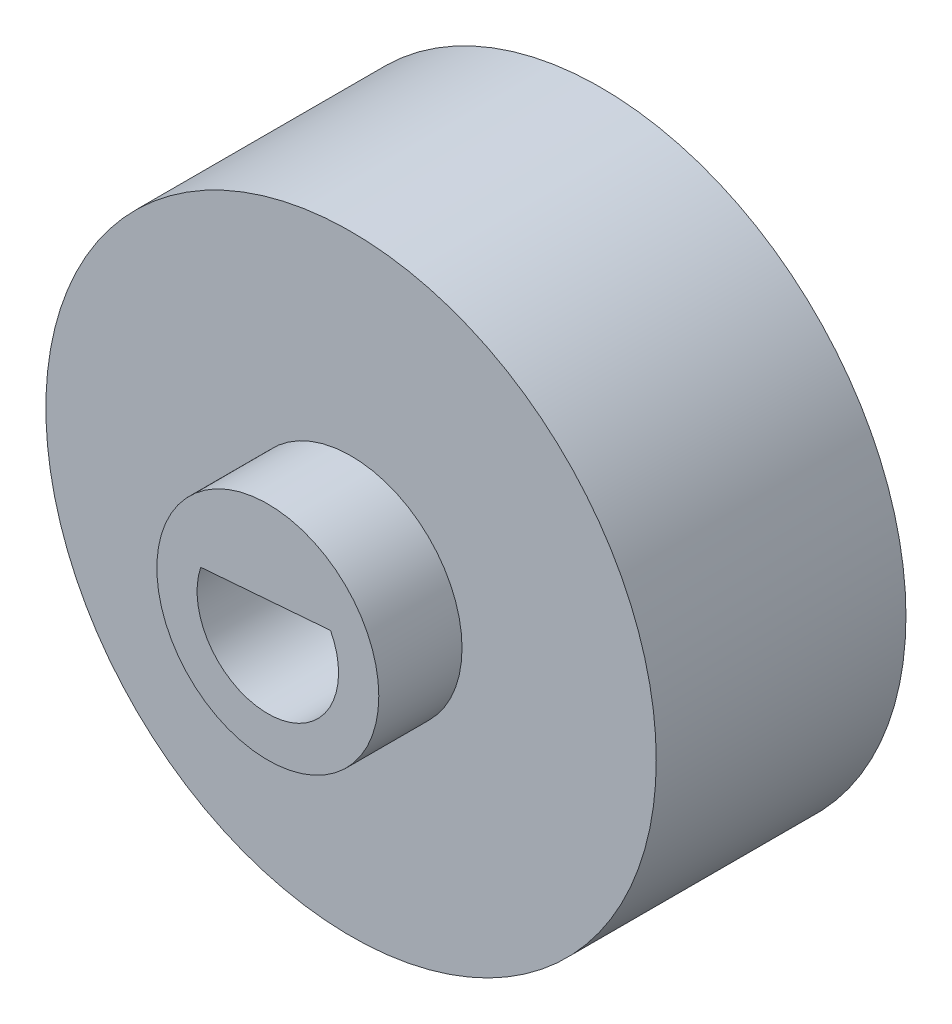
ISO-10303-21;
HEADER;
FILE_DESCRIPTION(('STEP AP214'),'2;1');
FILE_NAME('part.step','',(''),(''),'','','');
FILE_SCHEMA(('AUTOMOTIVE_DESIGN { 1 0 10303 214 1 1 1 1 }'));
ENDSEC;
DATA;
#1=APPLICATION_CONTEXT('core data for automotive mechanical design processes');
#2=APPLICATION_PROTOCOL_DEFINITION('international standard','automotive_design',2000,#1);
#3=PRODUCT_CONTEXT('',#1,'mechanical');
#4=PRODUCT('Part','Part','',(#3));
#5=PRODUCT_RELATED_PRODUCT_CATEGORY('part','',(#4));
#6=PRODUCT_DEFINITION_FORMATION('','',#4);
#7=PRODUCT_DEFINITION_CONTEXT('part definition',#1,'design');
#8=PRODUCT_DEFINITION('design','',#6,#7);
#9=PRODUCT_DEFINITION_SHAPE('','',#8);
#10=(LENGTH_UNIT() NAMED_UNIT(*) SI_UNIT(.MILLI.,.METRE.));
#11=(NAMED_UNIT(*) PLANE_ANGLE_UNIT() SI_UNIT($,.RADIAN.));
#12=(NAMED_UNIT(*) SI_UNIT($,.STERADIAN.) SOLID_ANGLE_UNIT());
#13=UNCERTAINTY_MEASURE_WITH_UNIT(LENGTH_MEASURE(1.E-05),#10,'distance_accuracy_value','');
#14=(GEOMETRIC_REPRESENTATION_CONTEXT(3) GLOBAL_UNCERTAINTY_ASSIGNED_CONTEXT((#13)) GLOBAL_UNIT_ASSIGNED_CONTEXT((#10,
#11,#12)) REPRESENTATION_CONTEXT('',''));
#15=CARTESIAN_POINT('',(0.,0.,0.));
#16=DIRECTION('',(0.,0.,1.));
#17=DIRECTION('',(1.,0.,0.));
#18=AXIS2_PLACEMENT_3D('',#15,#16,#17);
#19=CARTESIAN_POINT('',(0.,0.,24.));
#20=DIRECTION('',(0.,0.,1.));
#21=DIRECTION('',(1.,0.,0.));
#22=AXIS2_PLACEMENT_3D('',#19,#20,#21);
#23=PLANE('',#22);
#24=CARTESIAN_POINT('',(0.,0.,24.));
#25=DIRECTION('',(0.,0.,1.));
#26=DIRECTION('',(1.,0.,0.));
#27=AXIS2_PLACEMENT_3D('',#24,#25,#26);
#28=CIRCLE('',#27,8.);
#29=CARTESIAN_POINT('',(8.,0.,24.));
#30=VERTEX_POINT('',#29);
#31=EDGE_CURVE('E11',#30,#30,#28,.T.);
#32=ORIENTED_EDGE('',*,*,#31,.T.);
#33=EDGE_LOOP('',(#32));
#34=FACE_BOUND('',#33,.T.);
#35=DIRECTION('',(-0.996917333733128,-0.0784590957278449,0.));
#36=VECTOR('',#35,1.);
#37=CARTESIAN_POINT('',(4.52010117863992,2.36192407474458,24.));
#38=LINE('',#37,#36);
#39=CARTESIAN_POINT('',(4.52010117863992,2.36192407474458,24.));
#40=VERTEX_POINT('',#39);
#41=CARTESIAN_POINT('',(-4.83393756155129,1.62574526018793,24.));
#42=VERTEX_POINT('',#41);
#43=EDGE_CURVE('E83',#40,#42,#38,.T.);
#44=ORIENTED_EDGE('',*,*,#43,.F.);
#45=CARTESIAN_POINT('',(0.,0.,24.));
#46=DIRECTION('',(0.,0.,1.));
#47=DIRECTION('',(1.,0.,0.));
#48=AXIS2_PLACEMENT_3D('',#45,#46,#47);
#49=CIRCLE('',#48,5.1);
#50=EDGE_CURVE('E70',#42,#40,#49,.T.);
#51=ORIENTED_EDGE('',*,*,#50,.F.);
#52=EDGE_LOOP('',(#44,#51));
#53=FACE_BOUND('',#52,.T.);
#54=ADVANCED_FACE('F39',(#34,#53),#23,.T.);
#55=CARTESIAN_POINT('',(0.,0.,0.));
#56=DIRECTION('',(0.,0.,1.));
#57=DIRECTION('',(1.,0.,0.));
#58=AXIS2_PLACEMENT_3D('',#55,#56,#57);
#59=PLANE('',#58);
#60=CARTESIAN_POINT('',(0.,0.,0.));
#61=DIRECTION('',(0.,0.,1.));
#62=DIRECTION('',(1.,0.,0.));
#63=AXIS2_PLACEMENT_3D('',#60,#61,#62);
#64=CIRCLE('',#63,5.1);
#65=CARTESIAN_POINT('',(-4.83393756155129,1.62574526018793,0.));
#66=VERTEX_POINT('',#65);
#67=CARTESIAN_POINT('',(4.52010117863992,2.36192407474458,0.));
#68=VERTEX_POINT('',#67);
#69=EDGE_CURVE('E60',#66,#68,#64,.T.);
#70=ORIENTED_EDGE('',*,*,#69,.T.);
#71=DIRECTION('',(-0.996917333733128,-0.0784590957278449,0.));
#72=VECTOR('',#71,1.);
#73=CARTESIAN_POINT('',(4.52010117863992,2.36192407474458,0.));
#74=LINE('',#73,#72);
#75=EDGE_CURVE('E66',#68,#66,#74,.T.);
#76=ORIENTED_EDGE('',*,*,#75,.T.);
#77=EDGE_LOOP('',(#70,#76));
#78=FACE_BOUND('',#77,.T.);
#79=CARTESIAN_POINT('',(0.,0.,0.));
#80=DIRECTION('',(0.,0.,1.));
#81=DIRECTION('',(1.,0.,0.));
#82=AXIS2_PLACEMENT_3D('',#79,#80,#81);
#83=CIRCLE('',#82,22.);
#84=CARTESIAN_POINT('',(22.,0.,0.));
#85=VERTEX_POINT('',#84);
#86=EDGE_CURVE('E80',#85,#85,#83,.T.);
#87=ORIENTED_EDGE('',*,*,#86,.F.);
#88=EDGE_LOOP('',(#87));
#89=FACE_BOUND('',#88,.T.);
#90=ADVANCED_FACE('F75',(#78,#89),#59,.F.);
#91=CARTESIAN_POINT('',(0.,0.,24.));
#92=DIRECTION('',(0.,0.,-1.));
#93=DIRECTION('',(-1.,0.,0.));
#94=AXIS2_PLACEMENT_3D('',#91,#92,#93);
#95=CYLINDRICAL_SURFACE('',#94,8.);
#96=CARTESIAN_POINT('',(0.,0.,18.));
#97=DIRECTION('',(0.,0.,1.));
#98=DIRECTION('',(1.,0.,0.));
#99=AXIS2_PLACEMENT_3D('',#96,#97,#98);
#100=CIRCLE('',#99,8.);
#101=CARTESIAN_POINT('',(8.,0.,18.));
#102=VERTEX_POINT('',#101);
#103=EDGE_CURVE('E88',#102,#102,#100,.T.);
#104=ORIENTED_EDGE('',*,*,#103,.T.);
#105=EDGE_LOOP('',(#104));
#106=FACE_BOUND('',#105,.T.);
#107=ORIENTED_EDGE('',*,*,#31,.F.);
#108=EDGE_LOOP('',(#107));
#109=FACE_BOUND('',#108,.T.);
#110=ADVANCED_FACE('F41',(#106,#109),#95,.T.);
#111=CARTESIAN_POINT('',(0.,0.,24.));
#112=DIRECTION('',(0.,0.,-1.));
#113=DIRECTION('',(-1.,0.,0.));
#114=AXIS2_PLACEMENT_3D('',#111,#112,#113);
#115=CYLINDRICAL_SURFACE('',#114,5.1);
#116=ORIENTED_EDGE('',*,*,#69,.F.);
#117=DIRECTION('',(0.,0.,-1.));
#118=VECTOR('',#117,1.);
#119=CARTESIAN_POINT('',(-4.83393756155129,1.62574526018793,24.));
#120=LINE('',#119,#118);
#121=EDGE_CURVE('E68',#42,#66,#120,.T.);
#122=ORIENTED_EDGE('',*,*,#121,.F.);
#123=ORIENTED_EDGE('',*,*,#50,.T.);
#124=DIRECTION('',(0.,0.,-1.));
#125=VECTOR('',#124,1.);
#126=CARTESIAN_POINT('',(4.52010117863992,2.36192407474458,24.));
#127=LINE('',#126,#125);
#128=EDGE_CURVE('E47',#40,#68,#127,.T.);
#129=ORIENTED_EDGE('',*,*,#128,.T.);
#130=EDGE_LOOP('',(#116,#122,#123,#129));
#131=FACE_BOUND('',#130,.T.);
#132=ADVANCED_FACE('F72',(#131),#115,.F.);
#133=CARTESIAN_POINT('',(4.52010117863992,2.36192407474458,24.));
#134=DIRECTION('',(0.0784590957278449,-0.996917333733128,0.));
#135=DIRECTION('',(0.996917333733128,0.0784590957278449,0.));
#136=AXIS2_PLACEMENT_3D('',#133,#134,#135);
#137=PLANE('',#136);
#138=ORIENTED_EDGE('',*,*,#75,.F.);
#139=ORIENTED_EDGE('',*,*,#128,.F.);
#140=ORIENTED_EDGE('',*,*,#43,.T.);
#141=ORIENTED_EDGE('',*,*,#121,.T.);
#142=EDGE_LOOP('',(#138,#139,#140,#141));
#143=FACE_BOUND('',#142,.T.);
#144=ADVANCED_FACE('F67',(#143),#137,.T.);
#145=CARTESIAN_POINT('',(0.,0.,18.));
#146=DIRECTION('',(0.,0.,1.));
#147=DIRECTION('',(1.,0.,0.));
#148=AXIS2_PLACEMENT_3D('',#145,#146,#147);
#149=PLANE('',#148);
#150=CARTESIAN_POINT('',(0.,0.,18.));
#151=DIRECTION('',(0.,0.,1.));
#152=DIRECTION('',(1.,0.,0.));
#153=AXIS2_PLACEMENT_3D('',#150,#151,#152);
#154=CIRCLE('',#153,22.);
#155=CARTESIAN_POINT('',(22.,0.,18.));
#156=VERTEX_POINT('',#155);
#157=EDGE_CURVE('E77',#156,#156,#154,.T.);
#158=ORIENTED_EDGE('',*,*,#157,.T.);
#159=EDGE_LOOP('',(#158));
#160=FACE_BOUND('',#159,.T.);
#161=ORIENTED_EDGE('',*,*,#103,.F.);
#162=EDGE_LOOP('',(#161));
#163=FACE_BOUND('',#162,.T.);
#164=ADVANCED_FACE('F95',(#160,#163),#149,.T.);
#165=CARTESIAN_POINT('',(0.,0.,18.));
#166=DIRECTION('',(0.,0.,-1.));
#167=DIRECTION('',(-1.,0.,0.));
#168=AXIS2_PLACEMENT_3D('',#165,#166,#167);
#169=CYLINDRICAL_SURFACE('',#168,22.);
#170=ORIENTED_EDGE('',*,*,#157,.F.);
#171=EDGE_LOOP('',(#170));
#172=FACE_BOUND('',#171,.T.);
#173=ORIENTED_EDGE('',*,*,#86,.T.);
#174=EDGE_LOOP('',(#173));
#175=FACE_BOUND('',#174,.T.);
#176=ADVANCED_FACE('F97',(#172,#175),#169,.T.);
#177=CLOSED_SHELL('',(#54,#90,#110,#132,#144,#164,#176));
#178=MANIFOLD_SOLID_BREP('B2',#177);
#179=ADVANCED_BREP_SHAPE_REPRESENTATION('',(#18,#178),#14);
#180=SHAPE_DEFINITION_REPRESENTATION(#9,#179);
ENDSEC;
END-ISO-10303-21;
